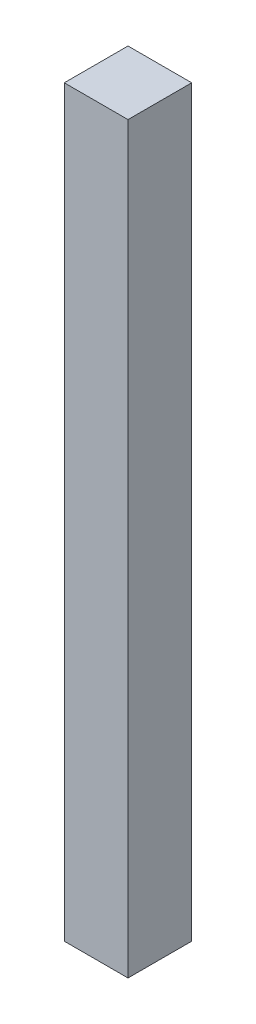
ISO-10303-21;
HEADER;
FILE_DESCRIPTION(('STEP AP214'),'2;1');
FILE_NAME('part.step','',(''),(''),'','','');
FILE_SCHEMA(('AUTOMOTIVE_DESIGN { 1 0 10303 214 1 1 1 1 }'));
ENDSEC;
DATA;
#1=APPLICATION_CONTEXT('core data for automotive mechanical design processes');
#2=APPLICATION_PROTOCOL_DEFINITION('international standard','automotive_design',2000,#1);
#3=PRODUCT_CONTEXT('',#1,'mechanical');
#4=PRODUCT('Part','Part','',(#3));
#5=PRODUCT_RELATED_PRODUCT_CATEGORY('part','',(#4));
#6=PRODUCT_DEFINITION_FORMATION('','',#4);
#7=PRODUCT_DEFINITION_CONTEXT('part definition',#1,'design');
#8=PRODUCT_DEFINITION('design','',#6,#7);
#9=PRODUCT_DEFINITION_SHAPE('','',#8);
#10=(LENGTH_UNIT() NAMED_UNIT(*) SI_UNIT(.MILLI.,.METRE.));
#11=(NAMED_UNIT(*) PLANE_ANGLE_UNIT() SI_UNIT($,.RADIAN.));
#12=(NAMED_UNIT(*) SI_UNIT($,.STERADIAN.) SOLID_ANGLE_UNIT());
#13=UNCERTAINTY_MEASURE_WITH_UNIT(LENGTH_MEASURE(1.E-05),#10,'distance_accuracy_value','');
#14=(GEOMETRIC_REPRESENTATION_CONTEXT(3) GLOBAL_UNCERTAINTY_ASSIGNED_CONTEXT((#13)) GLOBAL_UNIT_ASSIGNED_CONTEXT((#10,
#11,#12)) REPRESENTATION_CONTEXT('',''));
#15=CARTESIAN_POINT('',(0.,0.,0.));
#16=DIRECTION('',(0.,0.,1.));
#17=DIRECTION('',(1.,0.,0.));
#18=AXIS2_PLACEMENT_3D('',#15,#16,#17);
#19=CARTESIAN_POINT('',(9.525,222.25,9.525));
#20=DIRECTION('',(-1.,0.,0.));
#21=DIRECTION('',(0.,0.,1.));
#22=AXIS2_PLACEMENT_3D('',#19,#20,#21);
#23=PLANE('',#22);
#24=DIRECTION('',(0.,0.,-1.));
#25=VECTOR('',#24,1.);
#26=CARTESIAN_POINT('',(9.525,0.,9.525));
#27=LINE('',#26,#25);
#28=CARTESIAN_POINT('',(9.525,0.,9.525));
#29=VERTEX_POINT('',#28);
#30=CARTESIAN_POINT('',(9.525,0.,-9.525));
#31=VERTEX_POINT('',#30);
#32=EDGE_CURVE('E97',#29,#31,#27,.T.);
#33=ORIENTED_EDGE('',*,*,#32,.T.);
#34=DIRECTION('',(0.,-1.,0.));
#35=VECTOR('',#34,1.);
#36=CARTESIAN_POINT('',(9.525,222.25,-9.525));
#37=LINE('',#36,#35);
#38=CARTESIAN_POINT('',(9.525,222.25,-9.525));
#39=VERTEX_POINT('',#38);
#40=EDGE_CURVE('E11',#39,#31,#37,.T.);
#41=ORIENTED_EDGE('',*,*,#40,.F.);
#42=DIRECTION('',(0.,0.,-1.));
#43=VECTOR('',#42,1.);
#44=CARTESIAN_POINT('',(9.525,222.25,9.525));
#45=LINE('',#44,#43);
#46=CARTESIAN_POINT('',(9.525,222.25,9.525));
#47=VERTEX_POINT('',#46);
#48=EDGE_CURVE('E85',#47,#39,#45,.T.);
#49=ORIENTED_EDGE('',*,*,#48,.F.);
#50=DIRECTION('',(0.,-1.,0.));
#51=VECTOR('',#50,1.);
#52=CARTESIAN_POINT('',(9.525,222.25,9.525));
#53=LINE('',#52,#51);
#54=EDGE_CURVE('E93',#47,#29,#53,.T.);
#55=ORIENTED_EDGE('',*,*,#54,.T.);
#56=EDGE_LOOP('',(#33,#41,#49,#55));
#57=FACE_BOUND('',#56,.T.);
#58=ADVANCED_FACE('F34',(#57),#23,.F.);
#59=CARTESIAN_POINT('',(-9.525,222.25,-9.525));
#60=DIRECTION('',(0.,0.,1.));
#61=DIRECTION('',(1.,0.,0.));
#62=AXIS2_PLACEMENT_3D('',#59,#60,#61);
#63=PLANE('',#62);
#64=DIRECTION('',(-1.,0.,0.));
#65=VECTOR('',#64,1.);
#66=CARTESIAN_POINT('',(-9.525,0.,-9.525));
#67=LINE('',#66,#65);
#68=CARTESIAN_POINT('',(-9.525,0.,-9.525));
#69=VERTEX_POINT('',#68);
#70=EDGE_CURVE('E89',#31,#69,#67,.T.);
#71=ORIENTED_EDGE('',*,*,#70,.T.);
#72=DIRECTION('',(0.,-1.,0.));
#73=VECTOR('',#72,1.);
#74=CARTESIAN_POINT('',(-9.525,222.25,-9.525));
#75=LINE('',#74,#73);
#76=CARTESIAN_POINT('',(-9.525,222.25,-9.525));
#77=VERTEX_POINT('',#76);
#78=EDGE_CURVE('E42',#77,#69,#75,.T.);
#79=ORIENTED_EDGE('',*,*,#78,.F.);
#80=DIRECTION('',(-1.,0.,0.));
#81=VECTOR('',#80,1.);
#82=CARTESIAN_POINT('',(-9.525,222.25,-9.525));
#83=LINE('',#82,#81);
#84=EDGE_CURVE('E80',#39,#77,#83,.T.);
#85=ORIENTED_EDGE('',*,*,#84,.F.);
#86=ORIENTED_EDGE('',*,*,#40,.T.);
#87=EDGE_LOOP('',(#71,#79,#85,#86));
#88=FACE_BOUND('',#87,.T.);
#89=ADVANCED_FACE('F88',(#88),#63,.F.);
#90=CARTESIAN_POINT('',(-9.525,222.25,9.525));
#91=DIRECTION('',(1.,0.,0.));
#92=DIRECTION('',(0.,0.,-1.));
#93=AXIS2_PLACEMENT_3D('',#90,#91,#92);
#94=PLANE('',#93);
#95=DIRECTION('',(0.,0.,1.));
#96=VECTOR('',#95,1.);
#97=CARTESIAN_POINT('',(-9.525,0.,9.525));
#98=LINE('',#97,#96);
#99=CARTESIAN_POINT('',(-9.525,0.,9.525));
#100=VERTEX_POINT('',#99);
#101=EDGE_CURVE('E67',#69,#100,#98,.T.);
#102=ORIENTED_EDGE('',*,*,#101,.T.);
#103=DIRECTION('',(0.,-1.,0.));
#104=VECTOR('',#103,1.);
#105=CARTESIAN_POINT('',(-9.525,222.25,9.525));
#106=LINE('',#105,#104);
#107=CARTESIAN_POINT('',(-9.525,222.25,9.525));
#108=VERTEX_POINT('',#107);
#109=EDGE_CURVE('E90',#108,#100,#106,.T.);
#110=ORIENTED_EDGE('',*,*,#109,.F.);
#111=DIRECTION('',(0.,0.,1.));
#112=VECTOR('',#111,1.);
#113=CARTESIAN_POINT('',(-9.525,222.25,9.525));
#114=LINE('',#113,#112);
#115=EDGE_CURVE('E83',#77,#108,#114,.T.);
#116=ORIENTED_EDGE('',*,*,#115,.F.);
#117=ORIENTED_EDGE('',*,*,#78,.T.);
#118=EDGE_LOOP('',(#102,#110,#116,#117));
#119=FACE_BOUND('',#118,.T.);
#120=ADVANCED_FACE('F91',(#119),#94,.F.);
#121=CARTESIAN_POINT('',(-9.525,222.25,9.525));
#122=DIRECTION('',(0.,0.,-1.));
#123=DIRECTION('',(-1.,0.,0.));
#124=AXIS2_PLACEMENT_3D('',#121,#122,#123);
#125=PLANE('',#124);
#126=DIRECTION('',(1.,0.,0.));
#127=VECTOR('',#126,1.);
#128=CARTESIAN_POINT('',(-9.525,0.,9.525));
#129=LINE('',#128,#127);
#130=EDGE_CURVE('E73',#100,#29,#129,.T.);
#131=ORIENTED_EDGE('',*,*,#130,.T.);
#132=ORIENTED_EDGE('',*,*,#54,.F.);
#133=DIRECTION('',(1.,0.,0.));
#134=VECTOR('',#133,1.);
#135=CARTESIAN_POINT('',(-9.525,222.25,9.525));
#136=LINE('',#135,#134);
#137=EDGE_CURVE('E50',#108,#47,#136,.T.);
#138=ORIENTED_EDGE('',*,*,#137,.F.);
#139=ORIENTED_EDGE('',*,*,#109,.T.);
#140=EDGE_LOOP('',(#131,#132,#138,#139));
#141=FACE_BOUND('',#140,.T.);
#142=ADVANCED_FACE('F104',(#141),#125,.F.);
#143=CARTESIAN_POINT('',(0.,222.25,0.));
#144=DIRECTION('',(0.,-1.,0.));
#145=DIRECTION('',(0.,0.,-1.));
#146=AXIS2_PLACEMENT_3D('',#143,#144,#145);
#147=PLANE('',#146);
#148=ORIENTED_EDGE('',*,*,#48,.T.);
#149=ORIENTED_EDGE('',*,*,#84,.T.);
#150=ORIENTED_EDGE('',*,*,#115,.T.);
#151=ORIENTED_EDGE('',*,*,#137,.T.);
#152=EDGE_LOOP('',(#148,#149,#150,#151));
#153=FACE_BOUND('',#152,.T.);
#154=ADVANCED_FACE('F81',(#153),#147,.F.);
#155=CARTESIAN_POINT('',(0.,0.,0.));
#156=DIRECTION('',(0.,-1.,0.));
#157=DIRECTION('',(0.,0.,-1.));
#158=AXIS2_PLACEMENT_3D('',#155,#156,#157);
#159=PLANE('',#158);
#160=ORIENTED_EDGE('',*,*,#32,.F.);
#161=ORIENTED_EDGE('',*,*,#130,.F.);
#162=ORIENTED_EDGE('',*,*,#101,.F.);
#163=ORIENTED_EDGE('',*,*,#70,.F.);
#164=EDGE_LOOP('',(#160,#161,#162,#163));
#165=FACE_BOUND('',#164,.T.);
#166=ADVANCED_FACE('F107',(#165),#159,.T.);
#167=CLOSED_SHELL('',(#58,#89,#120,#142,#154,#166));
#168=MANIFOLD_SOLID_BREP('B2',#167);
#169=ADVANCED_BREP_SHAPE_REPRESENTATION('',(#18,#168),#14);
#170=SHAPE_DEFINITION_REPRESENTATION(#9,#169);
ENDSEC;
END-ISO-10303-21;
